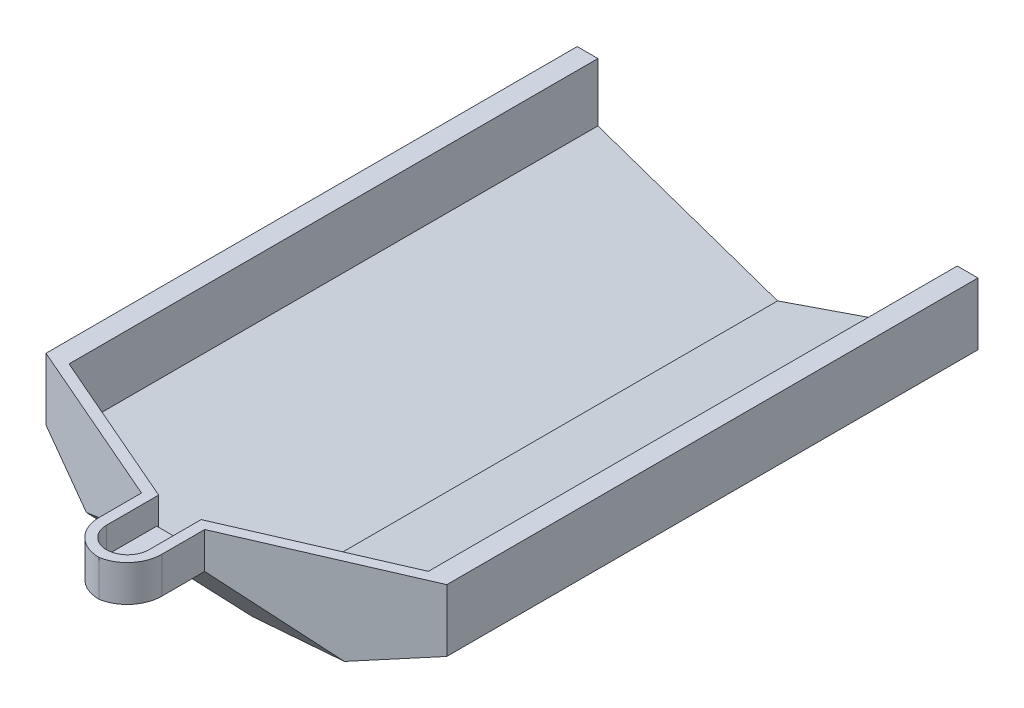
ISO-10303-21;
HEADER;
FILE_DESCRIPTION(('STEP AP214'),'2;1');
FILE_NAME('part.step','',(''),(''),'','','');
FILE_SCHEMA(('AUTOMOTIVE_DESIGN { 1 0 10303 214 1 1 1 1 }'));
ENDSEC;
DATA;
#1=APPLICATION_CONTEXT('core data for automotive mechanical design processes');
#2=APPLICATION_PROTOCOL_DEFINITION('international standard','automotive_design',2000,#1);
#3=PRODUCT_CONTEXT('',#1,'mechanical');
#4=PRODUCT('Part','Part','',(#3));
#5=PRODUCT_RELATED_PRODUCT_CATEGORY('part','',(#4));
#6=PRODUCT_DEFINITION_FORMATION('','',#4);
#7=PRODUCT_DEFINITION_CONTEXT('part definition',#1,'design');
#8=PRODUCT_DEFINITION('design','',#6,#7);
#9=PRODUCT_DEFINITION_SHAPE('','',#8);
#10=(LENGTH_UNIT() NAMED_UNIT(*) SI_UNIT(.MILLI.,.METRE.));
#11=(NAMED_UNIT(*) PLANE_ANGLE_UNIT() SI_UNIT($,.RADIAN.));
#12=(NAMED_UNIT(*) SI_UNIT($,.STERADIAN.) SOLID_ANGLE_UNIT());
#13=UNCERTAINTY_MEASURE_WITH_UNIT(LENGTH_MEASURE(1.E-05),#10,'distance_accuracy_value','');
#14=(GEOMETRIC_REPRESENTATION_CONTEXT(3) GLOBAL_UNCERTAINTY_ASSIGNED_CONTEXT((#13)) GLOBAL_UNIT_ASSIGNED_CONTEXT((#10,
#11,#12)) REPRESENTATION_CONTEXT('',''));
#15=CARTESIAN_POINT('',(0.,0.,0.));
#16=DIRECTION('',(0.,0.,1.));
#17=DIRECTION('',(1.,0.,0.));
#18=AXIS2_PLACEMENT_3D('',#15,#16,#17);
#19=CARTESIAN_POINT('',(-58.0000000000001,19.9221003062286,197.25));
#20=DIRECTION('',(1.,0.,0.));
#21=DIRECTION('',(0.,1.,0.));
#22=AXIS2_PLACEMENT_3D('',#19,#20,#21);
#23=PLANE('',#22);
#24=DIRECTION('',(0.,0.,-1.));
#25=VECTOR('',#24,1.);
#26=CARTESIAN_POINT('',(-58.0000000000001,19.9221003062286,197.25));
#27=LINE('',#26,#25);
#28=CARTESIAN_POINT('',(-58.,19.9221003062286,153.75));
#29=VERTEX_POINT('',#28);
#30=CARTESIAN_POINT('',(-58.0000000000001,19.9221003062286,0.));
#31=VERTEX_POINT('',#30);
#32=EDGE_CURVE('E335',#29,#31,#27,.T.);
#33=ORIENTED_EDGE('',*,*,#32,.F.);
#34=DIRECTION('',(0.,1.,0.));
#35=VECTOR('',#34,1.);
#36=CARTESIAN_POINT('',(-58.,0.,153.75));
#37=LINE('',#36,#35);
#38=CARTESIAN_POINT('',(-58.,37.9221003062286,153.75));
#39=VERTEX_POINT('',#38);
#40=EDGE_CURVE('E304',#29,#39,#37,.T.);
#41=ORIENTED_EDGE('',*,*,#40,.T.);
#42=DIRECTION('',(0.,0.,-1.));
#43=VECTOR('',#42,1.);
#44=CARTESIAN_POINT('',(-58.,37.9221003062286,197.25));
#45=LINE('',#44,#43);
#46=CARTESIAN_POINT('',(-58.,37.9221003062286,0.));
#47=VERTEX_POINT('',#46);
#48=EDGE_CURVE('E326',#39,#47,#45,.T.);
#49=ORIENTED_EDGE('',*,*,#48,.T.);
#50=DIRECTION('',(0.,-1.,0.));
#51=VECTOR('',#50,1.);
#52=CARTESIAN_POINT('',(-58.0000000000001,19.9221003062286,0.));
#53=LINE('',#52,#51);
#54=EDGE_CURVE('E311',#47,#31,#53,.T.);
#55=ORIENTED_EDGE('',*,*,#54,.T.);
#56=EDGE_LOOP('',(#33,#41,#49,#55));
#57=FACE_BOUND('',#56,.T.);
#58=ADVANCED_FACE('F31',(#57),#23,.F.);
#59=CARTESIAN_POINT('',(0.,0.,197.25));
#60=DIRECTION('',(0.324855184434761,0.945763770264994,0.));
#61=DIRECTION('',(-0.945763770264995,0.324855184434761,0.));
#62=AXIS2_PLACEMENT_3D('',#59,#60,#61);
#63=PLANE('',#62);
#64=DIRECTION('',(0.,0.,-1.));
#65=VECTOR('',#64,1.);
#66=CARTESIAN_POINT('',(0.,0.,197.25));
#67=LINE('',#66,#65);
#68=CARTESIAN_POINT('',(0.,0.,151.960177851496));
#69=VERTEX_POINT('',#68);
#70=CARTESIAN_POINT('',(0.,0.,0.));
#71=VERTEX_POINT('',#70);
#72=EDGE_CURVE('E333',#69,#71,#67,.T.);
#73=ORIENTED_EDGE('',*,*,#72,.F.);
#74=DIRECTION('',(-0.912471414880628,0.313419776789969,0.262990419108131));
#75=VECTOR('',#74,1.);
#76=CARTESIAN_POINT('',(-10.8682547723689,3.73307692635829,155.09260132356));
#77=LINE('',#76,#75);
#78=CARTESIAN_POINT('',(-37.3374208710378,12.8248248925636,162.721483688759));
#79=VERTEX_POINT('',#78);
#80=EDGE_CURVE('E280',#69,#79,#77,.T.);
#81=ORIENTED_EDGE('',*,*,#80,.T.);
#82=DIRECTION('',(-0.87487273062937,0.300505211979007,-0.379860925569558));
#83=VECTOR('',#82,1.);
#84=CARTESIAN_POINT('',(6.08728276581655,-2.09088720436162,181.576052517545));
#85=LINE('',#84,#83);
#86=EDGE_CURVE('E307',#79,#29,#85,.T.);
#87=ORIENTED_EDGE('',*,*,#86,.T.);
#88=ORIENTED_EDGE('',*,*,#32,.T.);
#89=DIRECTION('',(0.945763770264994,-0.324855184434761,0.));
#90=VECTOR('',#89,1.);
#91=CARTESIAN_POINT('',(0.,0.,0.));
#92=LINE('',#91,#90);
#93=EDGE_CURVE('E314',#31,#71,#92,.T.);
#94=ORIENTED_EDGE('',*,*,#93,.T.);
#95=EDGE_LOOP('',(#73,#81,#87,#88,#94));
#96=FACE_BOUND('',#95,.T.);
#97=ADVANCED_FACE('F448',(#96),#63,.F.);
#98=CARTESIAN_POINT('',(0.,0.,197.25));
#99=DIRECTION('',(-0.324855184434761,0.945763770264994,0.));
#100=DIRECTION('',(-0.945763770264995,-0.324855184434761,0.));
#101=AXIS2_PLACEMENT_3D('',#98,#99,#100);
#102=PLANE('',#101);
#103=DIRECTION('',(-0.87487273062937,-0.300505211979007,0.379860925569558));
#104=VECTOR('',#103,1.);
#105=CARTESIAN_POINT('',(-6.08728276581655,-2.09088720436162,181.576052517545));
#106=LINE('',#105,#104);
#107=CARTESIAN_POINT('',(58.,19.9221003062286,153.75));
#108=VERTEX_POINT('',#107);
#109=CARTESIAN_POINT('',(37.3374208710377,12.8248248925636,162.721483688759));
#110=VERTEX_POINT('',#109);
#111=EDGE_CURVE('E295',#108,#110,#106,.T.);
#112=ORIENTED_EDGE('',*,*,#111,.T.);
#113=DIRECTION('',(-0.912471414880628,-0.313419776789969,-0.262990419108131));
#114=VECTOR('',#113,1.);
#115=CARTESIAN_POINT('',(10.8682547723689,3.73307692635829,155.09260132356));
#116=LINE('',#115,#114);
#117=EDGE_CURVE('E277',#110,#69,#116,.T.);
#118=ORIENTED_EDGE('',*,*,#117,.T.);
#119=ORIENTED_EDGE('',*,*,#72,.T.);
#120=DIRECTION('',(0.945763770264994,0.324855184434761,0.));
#121=VECTOR('',#120,1.);
#122=CARTESIAN_POINT('',(0.,0.,0.));
#123=LINE('',#122,#121);
#124=CARTESIAN_POINT('',(58.0000000000001,19.9221003062286,0.));
#125=VERTEX_POINT('',#124);
#126=EDGE_CURVE('E317',#71,#125,#123,.T.);
#127=ORIENTED_EDGE('',*,*,#126,.T.);
#128=DIRECTION('',(0.,0.,-1.));
#129=VECTOR('',#128,1.);
#130=CARTESIAN_POINT('',(58.0000000000001,19.9221003062286,197.25));
#131=LINE('',#130,#129);
#132=EDGE_CURVE('E331',#108,#125,#131,.T.);
#133=ORIENTED_EDGE('',*,*,#132,.F.);
#134=EDGE_LOOP('',(#112,#118,#119,#127,#133));
#135=FACE_BOUND('',#134,.T.);
#136=ADVANCED_FACE('F445',(#135),#102,.F.);
#137=CARTESIAN_POINT('',(58.0000000000001,19.9221003062286,197.25));
#138=DIRECTION('',(-1.,0.,0.));
#139=DIRECTION('',(0.,-1.,0.));
#140=AXIS2_PLACEMENT_3D('',#137,#138,#139);
#141=PLANE('',#140);
#142=DIRECTION('',(0.,0.,-1.));
#143=VECTOR('',#142,1.);
#144=CARTESIAN_POINT('',(58.,37.9221003062286,197.25));
#145=LINE('',#144,#143);
#146=CARTESIAN_POINT('',(58.,37.9221003062286,153.75));
#147=VERTEX_POINT('',#146);
#148=CARTESIAN_POINT('',(58.,37.9221003062286,0.));
#149=VERTEX_POINT('',#148);
#150=EDGE_CURVE('E329',#147,#149,#145,.T.);
#151=ORIENTED_EDGE('',*,*,#150,.F.);
#152=DIRECTION('',(0.,1.,0.));
#153=VECTOR('',#152,1.);
#154=CARTESIAN_POINT('',(58.,0.,153.75));
#155=LINE('',#154,#153);
#156=EDGE_CURVE('E292',#108,#147,#155,.T.);
#157=ORIENTED_EDGE('',*,*,#156,.F.);
#158=ORIENTED_EDGE('',*,*,#132,.T.);
#159=DIRECTION('',(0.,1.,0.));
#160=VECTOR('',#159,1.);
#161=CARTESIAN_POINT('',(58.0000000000001,19.9221003062286,0.));
#162=LINE('',#161,#160);
#163=EDGE_CURVE('E320',#125,#149,#162,.T.);
#164=ORIENTED_EDGE('',*,*,#163,.T.);
#165=EDGE_LOOP('',(#151,#157,#158,#164));
#166=FACE_BOUND('',#165,.T.);
#167=ADVANCED_FACE('F441',(#166),#141,.F.);
#168=CARTESIAN_POINT('',(58.,37.9221003062286,197.25));
#169=DIRECTION('',(0.,-1.,0.));
#170=DIRECTION('',(0.,0.,-1.));
#171=AXIS2_PLACEMENT_3D('',#168,#169,#170);
#172=PLANE('',#171);
#173=DIRECTION('',(0.,0.,-1.));
#174=VECTOR('',#173,1.);
#175=CARTESIAN_POINT('',(-52.,37.9221003062286,197.25));
#176=LINE('',#175,#174);
#177=CARTESIAN_POINT('',(-52.,37.9221003062286,153.084560395029));
#178=VERTEX_POINT('',#177);
#179=CARTESIAN_POINT('',(-52.,37.9221003062286,0.));
#180=VERTEX_POINT('',#179);
#181=EDGE_CURVE('E235',#178,#180,#176,.T.);
#182=ORIENTED_EDGE('',*,*,#181,.T.);
#183=DIRECTION('',(-1.,0.,0.));
#184=VECTOR('',#183,1.);
#185=CARTESIAN_POINT('',(58.,37.9221003062286,0.));
#186=LINE('',#185,#184);
#187=EDGE_CURVE('E323',#180,#47,#186,.T.);
#188=ORIENTED_EDGE('',*,*,#187,.T.);
#189=ORIENTED_EDGE('',*,*,#48,.F.);
#190=DIRECTION('',(-0.917268733191235,0.,-0.398268842755426));
#191=VECTOR('',#190,1.);
#192=CARTESIAN_POINT('',(-9.15,37.9221003062286,174.960177851496));
#193=LINE('',#192,#191);
#194=CARTESIAN_POINT('',(-9.15,37.9221003062286,174.960177851496));
#195=VERTEX_POINT('',#194);
#196=EDGE_CURVE('E301',#195,#39,#193,.T.);
#197=ORIENTED_EDGE('',*,*,#196,.F.);
#198=DIRECTION('',(0.,0.,-1.));
#199=VECTOR('',#198,1.);
#200=CARTESIAN_POINT('',(-9.15,37.9221003062286,197.25));
#201=LINE('',#200,#199);
#202=CARTESIAN_POINT('',(-9.15,37.9221003062286,187.25));
#203=VERTEX_POINT('',#202);
#204=EDGE_CURVE('E299',#203,#195,#201,.T.);
#205=ORIENTED_EDGE('',*,*,#204,.F.);
#206=CARTESIAN_POINT('',(0.85,37.9221003062286,187.25));
#207=DIRECTION('',(0.,-1.,0.));
#208=DIRECTION('',(0.,0.,-1.));
#209=AXIS2_PLACEMENT_3D('',#206,#207,#208);
#210=CIRCLE('',#209,10.);
#211=CARTESIAN_POINT('',(0.850000000000017,37.9221003062286,197.25));
#212=VERTEX_POINT('',#211);
#213=EDGE_CURVE('E345',#203,#212,#210,.F.);
#214=ORIENTED_EDGE('',*,*,#213,.T.);
#215=CARTESIAN_POINT('',(-0.85,37.9221003062286,187.395559376606));
#216=DIRECTION('',(0.,-1.,0.));
#217=DIRECTION('',(0.,0.,-1.));
#218=AXIS2_PLACEMENT_3D('',#215,#216,#217);
#219=CIRCLE('',#218,10.);
#220=CARTESIAN_POINT('',(9.15,37.9221003062286,187.395559376606));
#221=VERTEX_POINT('',#220);
#222=EDGE_CURVE('E357',#212,#221,#219,.F.);
#223=ORIENTED_EDGE('',*,*,#222,.T.);
#224=DIRECTION('',(0.,0.,1.));
#225=VECTOR('',#224,1.);
#226=CARTESIAN_POINT('',(9.15,37.9221003062286,197.25));
#227=LINE('',#226,#225);
#228=CARTESIAN_POINT('',(9.15,37.9221003062286,174.960177851496));
#229=VERTEX_POINT('',#228);
#230=EDGE_CURVE('E289',#229,#221,#227,.T.);
#231=ORIENTED_EDGE('',*,*,#230,.F.);
#232=DIRECTION('',(-0.917268733191235,0.,0.398268842755426));
#233=VECTOR('',#232,1.);
#234=CARTESIAN_POINT('',(9.15,37.9221003062286,174.960177851496));
#235=LINE('',#234,#233);
#236=EDGE_CURVE('E286',#147,#229,#235,.T.);
#237=ORIENTED_EDGE('',*,*,#236,.F.);
#238=ORIENTED_EDGE('',*,*,#150,.T.);
#239=CARTESIAN_POINT('',(52.,37.9221003062286,0.));
#240=VERTEX_POINT('',#239);
#241=EDGE_CURVE('E324',#149,#240,#186,.T.);
#242=ORIENTED_EDGE('',*,*,#241,.T.);
#243=DIRECTION('',(0.,0.,-1.));
#244=VECTOR('',#243,1.);
#245=CARTESIAN_POINT('',(52.,37.9221003062286,197.25));
#246=LINE('',#245,#244);
#247=CARTESIAN_POINT('',(52.,37.9221003062286,153.084560395029));
#248=VERTEX_POINT('',#247);
#249=EDGE_CURVE('E197',#248,#240,#246,.T.);
#250=ORIENTED_EDGE('',*,*,#249,.F.);
#251=DIRECTION('',(-0.917268733191235,0.,0.398268842755426));
#252=VECTOR('',#251,1.);
#253=CARTESIAN_POINT('',(7.95519347173372,37.9221003062286,172.208371651922));
#254=LINE('',#253,#252);
#255=CARTESIAN_POINT('',(6.15,37.9221003062286,172.992168470588));
#256=VERTEX_POINT('',#255);
#257=EDGE_CURVE('E255',#248,#256,#254,.T.);
#258=ORIENTED_EDGE('',*,*,#257,.T.);
#259=DIRECTION('',(0.,0.,1.));
#260=VECTOR('',#259,1.);
#261=CARTESIAN_POINT('',(6.15,37.9221003062286,197.25));
#262=LINE('',#261,#260);
#263=CARTESIAN_POINT('',(6.15,37.9221003062286,188.08));
#264=VERTEX_POINT('',#263);
#265=EDGE_CURVE('E243',#256,#264,#262,.T.);
#266=ORIENTED_EDGE('',*,*,#265,.T.);
#267=CARTESIAN_POINT('',(-0.0199999999999992,37.9221003062286,188.08));
#268=DIRECTION('',(0.,-1.,0.));
#269=DIRECTION('',(0.,0.,-1.));
#270=AXIS2_PLACEMENT_3D('',#267,#268,#269);
#271=CIRCLE('',#270,6.17);
#272=CARTESIAN_POINT('',(-0.0199999999999992,37.9221003062286,194.25));
#273=VERTEX_POINT('',#272);
#274=EDGE_CURVE('E366',#264,#273,#271,.T.);
#275=ORIENTED_EDGE('',*,*,#274,.T.);
#276=CARTESIAN_POINT('',(0.0200000000000004,37.9221003062286,188.080129661006));
#277=DIRECTION('',(0.,-1.,0.));
#278=DIRECTION('',(0.,0.,-1.));
#279=AXIS2_PLACEMENT_3D('',#276,#277,#278);
#280=CIRCLE('',#279,6.17);
#281=CARTESIAN_POINT('',(-6.15,37.9221003062286,188.080129661006));
#282=VERTEX_POINT('',#281);
#283=EDGE_CURVE('E11',#273,#282,#280,.T.);
#284=ORIENTED_EDGE('',*,*,#283,.T.);
#285=DIRECTION('',(0.,0.,-1.));
#286=VECTOR('',#285,1.);
#287=CARTESIAN_POINT('',(-6.15,37.9221003062286,197.25));
#288=LINE('',#287,#286);
#289=CARTESIAN_POINT('',(-6.15,37.9221003062286,172.992168470588));
#290=VERTEX_POINT('',#289);
#291=EDGE_CURVE('E237',#282,#290,#288,.T.);
#292=ORIENTED_EDGE('',*,*,#291,.T.);
#293=DIRECTION('',(-0.917268733191235,0.,-0.398268842755426));
#294=VECTOR('',#293,1.);
#295=CARTESIAN_POINT('',(-7.95519347173372,37.9221003062286,172.208371651922));
#296=LINE('',#295,#294);
#297=EDGE_CURVE('E252',#290,#178,#296,.T.);
#298=ORIENTED_EDGE('',*,*,#297,.T.);
#299=EDGE_LOOP('',(#182,#188,#189,#197,#205,#214,#223,#231,#237,#238,#242,#250,#258,#266,#275,
#284,#292,#298));
#300=FACE_BOUND('',#299,.T.);
#301=ADVANCED_FACE('F379',(#300),#172,.F.);
#302=CARTESIAN_POINT('',(-58.,37.9221003062286,0.));
#303=DIRECTION('',(0.,0.,1.));
#304=DIRECTION('',(1.,0.,0.));
#305=AXIS2_PLACEMENT_3D('',#302,#303,#304);
#306=PLANE('',#305);
#307=ORIENTED_EDGE('',*,*,#187,.F.);
#308=DIRECTION('',(0.,-1.,0.));
#309=VECTOR('',#308,1.);
#310=CARTESIAN_POINT('',(-52.,37.9221003062286,0.));
#311=LINE('',#310,#309);
#312=CARTESIAN_POINT('',(-52.0000000000001,21.0332328389297,0.));
#313=VERTEX_POINT('',#312);
#314=EDGE_CURVE('E206',#180,#313,#311,.T.);
#315=ORIENTED_EDGE('',*,*,#314,.T.);
#316=DIRECTION('',(0.945763770264995,-0.324855184434761,0.));
#317=VECTOR('',#316,1.);
#318=CARTESIAN_POINT('',(-62.5556871990764,24.6589476523981,0.));
#319=LINE('',#318,#317);
#320=CARTESIAN_POINT('',(0.,3.17203946093159,0.));
#321=VERTEX_POINT('',#320);
#322=EDGE_CURVE('E212',#313,#321,#319,.T.);
#323=ORIENTED_EDGE('',*,*,#322,.T.);
#324=DIRECTION('',(0.945763770264995,0.324855184434761,0.));
#325=VECTOR('',#324,1.);
#326=CARTESIAN_POINT('',(-41.202729461843,-10.9804589740552,0.));
#327=LINE('',#326,#325);
#328=CARTESIAN_POINT('',(52.0000000000001,21.0332328389297,0.));
#329=VERTEX_POINT('',#328);
#330=EDGE_CURVE('E190',#321,#329,#327,.T.);
#331=ORIENTED_EDGE('',*,*,#330,.T.);
#332=DIRECTION('',(0.,1.,0.));
#333=VECTOR('',#332,1.);
#334=CARTESIAN_POINT('',(52.,37.9221003062294,0.));
#335=LINE('',#334,#333);
#336=EDGE_CURVE('E200',#329,#240,#335,.T.);
#337=ORIENTED_EDGE('',*,*,#336,.T.);
#338=ORIENTED_EDGE('',*,*,#241,.F.);
#339=ORIENTED_EDGE('',*,*,#163,.F.);
#340=ORIENTED_EDGE('',*,*,#126,.F.);
#341=ORIENTED_EDGE('',*,*,#93,.F.);
#342=ORIENTED_EDGE('',*,*,#54,.F.);
#343=EDGE_LOOP('',(#307,#315,#323,#331,#337,#338,#339,#340,#341,#342));
#344=FACE_BOUND('',#343,.T.);
#345=ADVANCED_FACE('F209',(#344),#306,.F.);
#346=CARTESIAN_POINT('',(-9.15,0.,174.960177851496));
#347=DIRECTION('',(0.398268842755426,0.,-0.917268733191235));
#348=DIRECTION('',(-0.917268733191235,0.,-0.398268842755426));
#349=AXIS2_PLACEMENT_3D('',#346,#347,#348);
#350=PLANE('',#349);
#351=ORIENTED_EDGE('',*,*,#86,.F.);
#352=DIRECTION('',(0.828664330042326,0.428790205836544,0.359797703569878));
#353=VECTOR('',#352,1.);
#354=CARTESIAN_POINT('',(-18.889525695469,22.3706403485988,170.731373917205));
#355=LINE('',#354,#353);
#356=CARTESIAN_POINT('',(-9.15,27.4103326296665,174.960177851496));
#357=VERTEX_POINT('',#356);
#358=EDGE_CURVE('E283',#79,#357,#355,.T.);
#359=ORIENTED_EDGE('',*,*,#358,.T.);
#360=DIRECTION('',(0.,1.,0.));
#361=VECTOR('',#360,1.);
#362=CARTESIAN_POINT('',(-9.15,0.,174.960177851496));
#363=LINE('',#362,#361);
#364=EDGE_CURVE('E303',#357,#195,#363,.T.);
#365=ORIENTED_EDGE('',*,*,#364,.T.);
#366=ORIENTED_EDGE('',*,*,#196,.T.);
#367=ORIENTED_EDGE('',*,*,#40,.F.);
#368=EDGE_LOOP('',(#351,#359,#365,#366,#367));
#369=FACE_BOUND('',#368,.T.);
#370=ADVANCED_FACE('F411',(#369),#350,.F.);
#371=CARTESIAN_POINT('',(-9.15,0.,197.25));
#372=DIRECTION('',(1.,0.,0.));
#373=DIRECTION('',(0.,0.,-1.));
#374=AXIS2_PLACEMENT_3D('',#371,#372,#373);
#375=PLANE('',#374);
#376=DIRECTION('',(0.,0.,1.));
#377=VECTOR('',#376,1.);
#378=CARTESIAN_POINT('',(-9.15,27.4103326296665,197.25));
#379=LINE('',#378,#377);
#380=CARTESIAN_POINT('',(-9.15,27.4103326296665,187.25));
#381=VERTEX_POINT('',#380);
#382=EDGE_CURVE('E274',#357,#381,#379,.T.);
#383=ORIENTED_EDGE('',*,*,#382,.T.);
#384=DIRECTION('',(0.,1.,0.));
#385=VECTOR('',#384,1.);
#386=CARTESIAN_POINT('',(-9.15,37.9221003062286,187.25));
#387=LINE('',#386,#385);
#388=EDGE_CURVE('E342',#381,#203,#387,.T.);
#389=ORIENTED_EDGE('',*,*,#388,.T.);
#390=ORIENTED_EDGE('',*,*,#204,.T.);
#391=ORIENTED_EDGE('',*,*,#364,.F.);
#392=EDGE_LOOP('',(#383,#389,#390,#391));
#393=FACE_BOUND('',#392,.T.);
#394=ADVANCED_FACE('F414',(#393),#375,.F.);
#395=CARTESIAN_POINT('',(9.15,0.,174.960177851496));
#396=DIRECTION('',(-0.398268842755426,0.,-0.917268733191235));
#397=DIRECTION('',(-0.917268733191235,0.,0.398268842755426));
#398=AXIS2_PLACEMENT_3D('',#395,#396,#397);
#399=PLANE('',#398);
#400=DIRECTION('',(0.,1.,0.));
#401=VECTOR('',#400,1.);
#402=CARTESIAN_POINT('',(9.15,0.,174.960177851496));
#403=LINE('',#402,#401);
#404=CARTESIAN_POINT('',(9.15,27.4103326296665,174.960177851496));
#405=VERTEX_POINT('',#404);
#406=EDGE_CURVE('E293',#405,#229,#403,.T.);
#407=ORIENTED_EDGE('',*,*,#406,.F.);
#408=DIRECTION('',(0.828664330042326,-0.428790205836544,-0.359797703569878));
#409=VECTOR('',#408,1.);
#410=CARTESIAN_POINT('',(18.889525695469,22.3706403485988,170.731373917205));
#411=LINE('',#410,#409);
#412=EDGE_CURVE('E339',#405,#110,#411,.T.);
#413=ORIENTED_EDGE('',*,*,#412,.T.);
#414=ORIENTED_EDGE('',*,*,#111,.F.);
#415=ORIENTED_EDGE('',*,*,#156,.T.);
#416=ORIENTED_EDGE('',*,*,#236,.T.);
#417=EDGE_LOOP('',(#407,#413,#414,#415,#416));
#418=FACE_BOUND('',#417,.T.);
#419=ADVANCED_FACE('F437',(#418),#399,.F.);
#420=CARTESIAN_POINT('',(9.15,0.,197.25));
#421=DIRECTION('',(-1.,0.,0.));
#422=DIRECTION('',(0.,0.,1.));
#423=AXIS2_PLACEMENT_3D('',#420,#421,#422);
#424=PLANE('',#423);
#425=ORIENTED_EDGE('',*,*,#230,.T.);
#426=DIRECTION('',(0.,1.,0.));
#427=VECTOR('',#426,1.);
#428=CARTESIAN_POINT('',(9.15,0.,187.395559376606));
#429=LINE('',#428,#427);
#430=CARTESIAN_POINT('',(9.15,27.4103326296665,187.395559376606));
#431=VERTEX_POINT('',#430);
#432=EDGE_CURVE('E352',#221,#431,#429,.F.);
#433=ORIENTED_EDGE('',*,*,#432,.T.);
#434=DIRECTION('',(0.,0.,-1.));
#435=VECTOR('',#434,1.);
#436=CARTESIAN_POINT('',(9.15,27.4103326296665,197.25));
#437=LINE('',#436,#435);
#438=EDGE_CURVE('E337',#431,#405,#437,.T.);
#439=ORIENTED_EDGE('',*,*,#438,.T.);
#440=ORIENTED_EDGE('',*,*,#406,.T.);
#441=EDGE_LOOP('',(#425,#433,#439,#440));
#442=FACE_BOUND('',#441,.T.);
#443=ADVANCED_FACE('F426',(#442),#424,.F.);
#444=CARTESIAN_POINT('',(-50.,27.4103326296665,174.960177851496));
#445=DIRECTION('',(0.,0.642787609686544,-0.766044443118974));
#446=DIRECTION('',(0.,0.766044443118974,0.642787609686544));
#447=AXIS2_PLACEMENT_3D('',#444,#445,#446);
#448=PLANE('',#447);
#449=ORIENTED_EDGE('',*,*,#80,.F.);
#450=ORIENTED_EDGE('',*,*,#117,.F.);
#451=ORIENTED_EDGE('',*,*,#412,.F.);
#452=DIRECTION('',(1.,0.,0.));
#453=VECTOR('',#452,1.);
#454=CARTESIAN_POINT('',(-50.,27.4103326296665,174.960177851496));
#455=LINE('',#454,#453);
#456=EDGE_CURVE('E262',#357,#405,#455,.T.);
#457=ORIENTED_EDGE('',*,*,#456,.F.);
#458=ORIENTED_EDGE('',*,*,#358,.F.);
#459=EDGE_LOOP('',(#449,#450,#451,#457,#458));
#460=FACE_BOUND('',#459,.T.);
#461=ADVANCED_FACE('F435',(#460),#448,.F.);
#462=CARTESIAN_POINT('',(-50.,27.4103326296665,197.25));
#463=DIRECTION('',(0.,1.,0.));
#464=DIRECTION('',(0.,0.,1.));
#465=AXIS2_PLACEMENT_3D('',#462,#463,#464);
#466=PLANE('',#465);
#467=ORIENTED_EDGE('',*,*,#438,.F.);
#468=CARTESIAN_POINT('',(-0.85,27.4103326296665,187.395559376606));
#469=DIRECTION('',(0.,1.,0.));
#470=DIRECTION('',(0.,0.,1.));
#471=AXIS2_PLACEMENT_3D('',#468,#469,#470);
#472=CIRCLE('',#471,10.);
#473=CARTESIAN_POINT('',(0.850000000000004,27.4103326296665,197.25));
#474=VERTEX_POINT('',#473);
#475=EDGE_CURVE('E355',#431,#474,#472,.F.);
#476=ORIENTED_EDGE('',*,*,#475,.T.);
#477=CARTESIAN_POINT('',(0.85,27.4103326296665,187.25));
#478=DIRECTION('',(0.,1.,0.));
#479=DIRECTION('',(0.,0.,1.));
#480=AXIS2_PLACEMENT_3D('',#477,#478,#479);
#481=CIRCLE('',#480,10.);
#482=EDGE_CURVE('E350',#474,#381,#481,.F.);
#483=ORIENTED_EDGE('',*,*,#482,.T.);
#484=ORIENTED_EDGE('',*,*,#382,.F.);
#485=ORIENTED_EDGE('',*,*,#456,.T.);
#486=EDGE_LOOP('',(#467,#476,#483,#484,#485));
#487=FACE_BOUND('',#486,.T.);
#488=ADVANCED_FACE('F431',(#487),#466,.F.);
#489=CARTESIAN_POINT('',(-52.0000000000001,19.9221003062286,197.25));
#490=DIRECTION('',(1.,0.,0.));
#491=DIRECTION('',(0.,1.,0.));
#492=AXIS2_PLACEMENT_3D('',#489,#490,#491);
#493=PLANE('',#492);
#494=DIRECTION('',(0.,0.,-1.));
#495=VECTOR('',#494,1.);
#496=CARTESIAN_POINT('',(-52.0000000000001,21.0332328389297,197.25));
#497=LINE('',#496,#495);
#498=CARTESIAN_POINT('',(-52.0000000000001,21.0332328389297,153.084560395028));
#499=VERTEX_POINT('',#498);
#500=EDGE_CURVE('E221',#499,#313,#497,.T.);
#501=ORIENTED_EDGE('',*,*,#500,.T.);
#502=ORIENTED_EDGE('',*,*,#314,.F.);
#503=ORIENTED_EDGE('',*,*,#181,.F.);
#504=DIRECTION('',(0.,1.,0.));
#505=VECTOR('',#504,1.);
#506=CARTESIAN_POINT('',(-52.0000000000001,19.9221003062287,153.084560395028));
#507=LINE('',#506,#505);
#508=EDGE_CURVE('E224',#499,#178,#507,.T.);
#509=ORIENTED_EDGE('',*,*,#508,.F.);
#510=EDGE_LOOP('',(#501,#502,#503,#509));
#511=FACE_BOUND('',#510,.T.);
#512=ADVANCED_FACE('F399',(#511),#493,.T.);
#513=CARTESIAN_POINT('',(0.974565553304283,2.83729131079498,197.25));
#514=DIRECTION('',(0.324855184434761,0.945763770264994,0.));
#515=DIRECTION('',(-0.945763770264995,0.324855184434761,0.));
#516=AXIS2_PLACEMENT_3D('',#513,#514,#515);
#517=PLANE('',#516);
#518=DIRECTION('',(0.,0.,-1.));
#519=VECTOR('',#518,1.);
#520=CARTESIAN_POINT('',(0.,3.17203946093159,197.25));
#521=LINE('',#520,#519);
#522=CARTESIAN_POINT('',(0.,3.17203946093159,150.705613125247));
#523=VERTEX_POINT('',#522);
#524=EDGE_CURVE('E196',#523,#321,#521,.T.);
#525=ORIENTED_EDGE('',*,*,#524,.T.);
#526=ORIENTED_EDGE('',*,*,#322,.F.);
#527=ORIENTED_EDGE('',*,*,#500,.F.);
#528=DIRECTION('',(-0.87487273062937,0.300505211979007,-0.379860925569558));
#529=VECTOR('',#528,1.);
#530=CARTESIAN_POINT('',(8.00813550002589,0.421369138562868,179.139488265903));
#531=LINE('',#530,#529);
#532=CARTESIAN_POINT('',(-34.5467327058177,15.0383062577897,160.662593217942));
#533=VERTEX_POINT('',#532);
#534=EDGE_CURVE('E226',#533,#499,#531,.T.);
#535=ORIENTED_EDGE('',*,*,#534,.F.);
#536=DIRECTION('',(-0.912471414880628,0.313419776789969,0.262990419108131));
#537=VECTOR('',#536,1.);
#538=CARTESIAN_POINT('',(-10.2621534853367,6.69692999701419,153.663347474014));
#539=LINE('',#538,#537);
#540=EDGE_CURVE('E229',#523,#533,#539,.T.);
#541=ORIENTED_EDGE('',*,*,#540,.F.);
#542=EDGE_LOOP('',(#525,#526,#527,#535,#541));
#543=FACE_BOUND('',#542,.T.);
#544=ADVANCED_FACE('F534',(#543),#517,.T.);
#545=CARTESIAN_POINT('',(-0.974565553304283,2.83729131079498,197.25));
#546=DIRECTION('',(-0.324855184434761,0.945763770264994,0.));
#547=DIRECTION('',(-0.945763770264995,-0.324855184434761,0.));
#548=AXIS2_PLACEMENT_3D('',#545,#546,#547);
#549=PLANE('',#548);
#550=DIRECTION('',(-0.87487273062937,-0.300505211979007,0.379860925569558));
#551=VECTOR('',#550,1.);
#552=CARTESIAN_POINT('',(-8.00813550002589,0.421369138562868,179.139488265903));
#553=LINE('',#552,#551);
#554=CARTESIAN_POINT('',(52.0000000000001,21.0332328389297,153.084560395028));
#555=VERTEX_POINT('',#554);
#556=CARTESIAN_POINT('',(34.5467327058177,15.0383062577897,160.662593217942));
#557=VERTEX_POINT('',#556);
#558=EDGE_CURVE('E193',#555,#557,#553,.T.);
#559=ORIENTED_EDGE('',*,*,#558,.F.);
#560=DIRECTION('',(0.,0.,-1.));
#561=VECTOR('',#560,1.);
#562=CARTESIAN_POINT('',(52.0000000000001,21.0332328389297,197.25));
#563=LINE('',#562,#561);
#564=EDGE_CURVE('E185',#555,#329,#563,.T.);
#565=ORIENTED_EDGE('',*,*,#564,.T.);
#566=ORIENTED_EDGE('',*,*,#330,.F.);
#567=ORIENTED_EDGE('',*,*,#524,.F.);
#568=DIRECTION('',(-0.912471414880628,-0.313419776789969,-0.262990419108131));
#569=VECTOR('',#568,1.);
#570=CARTESIAN_POINT('',(10.2621534853367,6.69692999701419,153.663347474014));
#571=LINE('',#570,#569);
#572=EDGE_CURVE('E233',#557,#523,#571,.T.);
#573=ORIENTED_EDGE('',*,*,#572,.F.);
#574=EDGE_LOOP('',(#559,#565,#566,#567,#573));
#575=FACE_BOUND('',#574,.T.);
#576=ADVANCED_FACE('F187',(#575),#549,.T.);
#577=CARTESIAN_POINT('',(52.0000000000001,19.9221003062286,197.25));
#578=DIRECTION('',(-1.,0.,0.));
#579=DIRECTION('',(0.,-1.,0.));
#580=AXIS2_PLACEMENT_3D('',#577,#578,#579);
#581=PLANE('',#580);
#582=ORIENTED_EDGE('',*,*,#249,.T.);
#583=ORIENTED_EDGE('',*,*,#336,.F.);
#584=ORIENTED_EDGE('',*,*,#564,.F.);
#585=DIRECTION('',(0.,1.,0.));
#586=VECTOR('',#585,1.);
#587=CARTESIAN_POINT('',(52.0000000000003,3.83418328522698E-13,153.084560395028));
#588=LINE('',#587,#586);
#589=EDGE_CURVE('E241',#555,#248,#588,.T.);
#590=ORIENTED_EDGE('',*,*,#589,.T.);
#591=EDGE_LOOP('',(#582,#583,#584,#590));
#592=FACE_BOUND('',#591,.T.);
#593=ADVANCED_FACE('F201',(#592),#581,.T.);
#594=CARTESIAN_POINT('',(-7.95519347173372,0.,172.208371651922));
#595=DIRECTION('',(0.398268842755426,0.,-0.917268733191235));
#596=DIRECTION('',(-0.917268733191235,0.,-0.398268842755426));
#597=AXIS2_PLACEMENT_3D('',#594,#595,#596);
#598=PLANE('',#597);
#599=ORIENTED_EDGE('',*,*,#534,.T.);
#600=ORIENTED_EDGE('',*,*,#508,.T.);
#601=ORIENTED_EDGE('',*,*,#297,.F.);
#602=DIRECTION('',(0.,1.,0.));
#603=VECTOR('',#602,1.);
#604=CARTESIAN_POINT('',(-6.15,0.,172.992168470588));
#605=LINE('',#604,#603);
#606=CARTESIAN_POINT('',(-6.15,29.7321218602918,172.992168470588));
#607=VERTEX_POINT('',#606);
#608=EDGE_CURVE('E227',#607,#290,#605,.T.);
#609=ORIENTED_EDGE('',*,*,#608,.F.);
#610=DIRECTION('',(0.828664330042326,0.428790205836544,0.359797703569878));
#611=VECTOR('',#610,1.);
#612=CARTESIAN_POINT('',(-18.1877998768903,23.5031935718408,167.765477041119));
#613=LINE('',#612,#611);
#614=EDGE_CURVE('E232',#533,#607,#613,.T.);
#615=ORIENTED_EDGE('',*,*,#614,.F.);
#616=EDGE_LOOP('',(#599,#600,#601,#609,#615));
#617=FACE_BOUND('',#616,.T.);
#618=ADVANCED_FACE('F393',(#617),#598,.T.);
#619=CARTESIAN_POINT('',(-6.15,0.,197.25));
#620=DIRECTION('',(1.,0.,0.));
#621=DIRECTION('',(0.,0.,-1.));
#622=AXIS2_PLACEMENT_3D('',#619,#620,#621);
#623=PLANE('',#622);
#624=ORIENTED_EDGE('',*,*,#291,.F.);
#625=DIRECTION('',(0.,1.,0.));
#626=VECTOR('',#625,1.);
#627=CARTESIAN_POINT('',(-6.15,30.4103326296665,188.080129661006));
#628=LINE('',#627,#626);
#629=CARTESIAN_POINT('',(-6.15,30.4103326296665,188.080129661006));
#630=VERTEX_POINT('',#629);
#631=EDGE_CURVE('E46',#282,#630,#628,.F.);
#632=ORIENTED_EDGE('',*,*,#631,.T.);
#633=DIRECTION('',(0.,0.,1.));
#634=VECTOR('',#633,1.);
#635=CARTESIAN_POINT('',(-6.15,30.4103326296665,197.25));
#636=LINE('',#635,#634);
#637=CARTESIAN_POINT('',(-6.15,30.4103326296665,173.561254877031));
#638=VERTEX_POINT('',#637);
#639=EDGE_CURVE('E216',#638,#630,#636,.T.);
#640=ORIENTED_EDGE('',*,*,#639,.F.);
#641=DIRECTION('',(0.,0.766044443118974,0.642787609686544));
#642=VECTOR('',#641,1.);
#643=CARTESIAN_POINT('',(-6.15,24.229246821255,168.374708054918));
#644=LINE('',#643,#642);
#645=EDGE_CURVE('E259',#607,#638,#644,.T.);
#646=ORIENTED_EDGE('',*,*,#645,.F.);
#647=ORIENTED_EDGE('',*,*,#608,.T.);
#648=EDGE_LOOP('',(#624,#632,#640,#646,#647));
#649=FACE_BOUND('',#648,.T.);
#650=ADVANCED_FACE('F387',(#649),#623,.T.);
#651=CARTESIAN_POINT('',(7.95519347173372,0.,172.208371651922));
#652=DIRECTION('',(-0.398268842755426,0.,-0.917268733191235));
#653=DIRECTION('',(-0.917268733191235,0.,0.398268842755426));
#654=AXIS2_PLACEMENT_3D('',#651,#652,#653);
#655=PLANE('',#654);
#656=DIRECTION('',(0.,1.,0.));
#657=VECTOR('',#656,1.);
#658=CARTESIAN_POINT('',(6.15,0.,172.992168470588));
#659=LINE('',#658,#657);
#660=CARTESIAN_POINT('',(6.15,29.7321218602918,172.992168470588));
#661=VERTEX_POINT('',#660);
#662=EDGE_CURVE('E238',#661,#256,#659,.T.);
#663=ORIENTED_EDGE('',*,*,#662,.T.);
#664=ORIENTED_EDGE('',*,*,#257,.F.);
#665=ORIENTED_EDGE('',*,*,#589,.F.);
#666=ORIENTED_EDGE('',*,*,#558,.T.);
#667=DIRECTION('',(0.828664330042326,-0.428790205836544,-0.359797703569878));
#668=VECTOR('',#667,1.);
#669=CARTESIAN_POINT('',(18.1877998768903,23.5031935718408,167.765477041119));
#670=LINE('',#669,#668);
#671=EDGE_CURVE('E245',#661,#557,#670,.T.);
#672=ORIENTED_EDGE('',*,*,#671,.F.);
#673=EDGE_LOOP('',(#663,#664,#665,#666,#672));
#674=FACE_BOUND('',#673,.T.);
#675=ADVANCED_FACE('F493',(#674),#655,.T.);
#676=CARTESIAN_POINT('',(6.15,0.,197.25));
#677=DIRECTION('',(-1.,0.,0.));
#678=DIRECTION('',(0.,0.,1.));
#679=AXIS2_PLACEMENT_3D('',#676,#677,#678);
#680=PLANE('',#679);
#681=DIRECTION('',(0.,0.,-1.));
#682=VECTOR('',#681,1.);
#683=CARTESIAN_POINT('',(6.15,30.4103326296665,197.25));
#684=LINE('',#683,#682);
#685=CARTESIAN_POINT('',(6.15,30.4103326296665,188.08));
#686=VERTEX_POINT('',#685);
#687=CARTESIAN_POINT('',(6.15,30.4103326296665,173.561254877031));
#688=VERTEX_POINT('',#687);
#689=EDGE_CURVE('E223',#686,#688,#684,.T.);
#690=ORIENTED_EDGE('',*,*,#689,.F.);
#691=DIRECTION('',(0.,-1.,0.));
#692=VECTOR('',#691,1.);
#693=CARTESIAN_POINT('',(6.15,0.,188.08));
#694=LINE('',#693,#692);
#695=EDGE_CURVE('E364',#686,#264,#694,.F.);
#696=ORIENTED_EDGE('',*,*,#695,.T.);
#697=ORIENTED_EDGE('',*,*,#265,.F.);
#698=ORIENTED_EDGE('',*,*,#662,.F.);
#699=DIRECTION('',(0.,-0.766044443118974,-0.642787609686544));
#700=VECTOR('',#699,1.);
#701=CARTESIAN_POINT('',(6.15,24.229246821255,168.374708054918));
#702=LINE('',#701,#700);
#703=EDGE_CURVE('E248',#688,#661,#702,.T.);
#704=ORIENTED_EDGE('',*,*,#703,.F.);
#705=EDGE_LOOP('',(#690,#696,#697,#698,#704));
#706=FACE_BOUND('',#705,.T.);
#707=ADVANCED_FACE('F384',(#706),#680,.T.);
#708=CARTESIAN_POINT('',(-50.,29.3386954587261,172.662044522139));
#709=DIRECTION('',(0.,0.642787609686544,-0.766044443118974));
#710=DIRECTION('',(0.,0.766044443118974,0.642787609686544));
#711=AXIS2_PLACEMENT_3D('',#708,#709,#710);
#712=PLANE('',#711);
#713=ORIENTED_EDGE('',*,*,#540,.T.);
#714=ORIENTED_EDGE('',*,*,#614,.T.);
#715=ORIENTED_EDGE('',*,*,#645,.T.);
#716=DIRECTION('',(1.,0.,0.));
#717=VECTOR('',#716,1.);
#718=CARTESIAN_POINT('',(-50.,30.4103326296665,173.561254877031));
#719=LINE('',#718,#717);
#720=EDGE_CURVE('E213',#638,#688,#719,.T.);
#721=ORIENTED_EDGE('',*,*,#720,.T.);
#722=ORIENTED_EDGE('',*,*,#703,.T.);
#723=ORIENTED_EDGE('',*,*,#671,.T.);
#724=ORIENTED_EDGE('',*,*,#572,.T.);
#725=EDGE_LOOP('',(#713,#714,#715,#721,#722,#723,#724));
#726=FACE_BOUND('',#725,.T.);
#727=ADVANCED_FACE('F388',(#726),#712,.T.);
#728=CARTESIAN_POINT('',(-50.,30.4103326296665,197.25));
#729=DIRECTION('',(0.,1.,0.));
#730=DIRECTION('',(0.,0.,1.));
#731=AXIS2_PLACEMENT_3D('',#728,#729,#730);
#732=PLANE('',#731);
#733=ORIENTED_EDGE('',*,*,#639,.T.);
#734=CARTESIAN_POINT('',(0.0200000000000004,30.4103326296665,188.080129661006));
#735=DIRECTION('',(0.,1.,0.));
#736=DIRECTION('',(0.,0.,1.));
#737=AXIS2_PLACEMENT_3D('',#734,#735,#736);
#738=CIRCLE('',#737,6.17);
#739=CARTESIAN_POINT('',(-0.0199999999999992,30.4103326296665,194.25));
#740=VERTEX_POINT('',#739);
#741=EDGE_CURVE('E39',#630,#740,#738,.T.);
#742=ORIENTED_EDGE('',*,*,#741,.T.);
#743=CARTESIAN_POINT('',(-0.0199999999999992,30.4103326296665,188.08));
#744=DIRECTION('',(0.,1.,0.));
#745=DIRECTION('',(0.,0.,1.));
#746=AXIS2_PLACEMENT_3D('',#743,#744,#745);
#747=CIRCLE('',#746,6.17);
#748=EDGE_CURVE('E362',#740,#686,#747,.T.);
#749=ORIENTED_EDGE('',*,*,#748,.T.);
#750=ORIENTED_EDGE('',*,*,#689,.T.);
#751=ORIENTED_EDGE('',*,*,#720,.F.);
#752=EDGE_LOOP('',(#733,#742,#749,#750,#751));
#753=FACE_BOUND('',#752,.T.);
#754=ADVANCED_FACE('F371',(#753),#732,.T.);
#755=CARTESIAN_POINT('',(0.85,0.,187.25));
#756=DIRECTION('',(0.,-1.,0.));
#757=DIRECTION('',(0.,0.,-1.));
#758=AXIS2_PLACEMENT_3D('',#755,#756,#757);
#759=CYLINDRICAL_SURFACE('',#758,10.);
#760=ORIENTED_EDGE('',*,*,#482,.F.);
#761=DIRECTION('',(0.,1.,0.));
#762=VECTOR('',#761,1.);
#763=CARTESIAN_POINT('',(0.85,27.4103326296665,197.25));
#764=LINE('',#763,#762);
#765=EDGE_CURVE('E347',#212,#474,#764,.F.);
#766=ORIENTED_EDGE('',*,*,#765,.F.);
#767=ORIENTED_EDGE('',*,*,#213,.F.);
#768=ORIENTED_EDGE('',*,*,#388,.F.);
#769=EDGE_LOOP('',(#760,#766,#767,#768));
#770=FACE_BOUND('',#769,.T.);
#771=ADVANCED_FACE('F418',(#770),#759,.T.);
#772=CARTESIAN_POINT('',(-0.85,37.9221003062286,187.395559376606));
#773=DIRECTION('',(0.,1.,0.));
#774=DIRECTION('',(0.,0.,1.));
#775=AXIS2_PLACEMENT_3D('',#772,#773,#774);
#776=CYLINDRICAL_SURFACE('',#775,10.);
#777=ORIENTED_EDGE('',*,*,#222,.F.);
#778=ORIENTED_EDGE('',*,*,#765,.T.);
#779=ORIENTED_EDGE('',*,*,#475,.F.);
#780=ORIENTED_EDGE('',*,*,#432,.F.);
#781=EDGE_LOOP('',(#777,#778,#779,#780));
#782=FACE_BOUND('',#781,.T.);
#783=ADVANCED_FACE('F429',(#782),#776,.T.);
#784=CARTESIAN_POINT('',(-0.0199999999999992,37.9221003062286,188.08));
#785=DIRECTION('',(0.,-1.,0.));
#786=DIRECTION('',(0.,0.,-1.));
#787=AXIS2_PLACEMENT_3D('',#784,#785,#786);
#788=CYLINDRICAL_SURFACE('',#787,6.17);
#789=ORIENTED_EDGE('',*,*,#274,.F.);
#790=ORIENTED_EDGE('',*,*,#695,.F.);
#791=ORIENTED_EDGE('',*,*,#748,.F.);
#792=DIRECTION('',(0.,-1.,0.));
#793=VECTOR('',#792,1.);
#794=CARTESIAN_POINT('',(-0.0199999999999992,37.9221003062286,194.25));
#795=LINE('',#794,#793);
#796=EDGE_CURVE('E359',#273,#740,#795,.T.);
#797=ORIENTED_EDGE('',*,*,#796,.F.);
#798=EDGE_LOOP('',(#789,#790,#791,#797));
#799=FACE_BOUND('',#798,.T.);
#800=ADVANCED_FACE('F378',(#799),#788,.F.);
#801=CARTESIAN_POINT('',(0.0200000000000004,37.9221003062286,188.080129661006));
#802=DIRECTION('',(0.,-1.,0.));
#803=DIRECTION('',(0.,0.,-1.));
#804=AXIS2_PLACEMENT_3D('',#801,#802,#803);
#805=CYLINDRICAL_SURFACE('',#804,6.17);
#806=ORIENTED_EDGE('',*,*,#741,.F.);
#807=ORIENTED_EDGE('',*,*,#631,.F.);
#808=ORIENTED_EDGE('',*,*,#283,.F.);
#809=ORIENTED_EDGE('',*,*,#796,.T.);
#810=EDGE_LOOP('',(#806,#807,#808,#809));
#811=FACE_BOUND('',#810,.T.);
#812=ADVANCED_FACE('F33',(#811),#805,.F.);
#813=CLOSED_SHELL('',(#58,#97,#136,#167,#301,#345,#370,#394,#419,#443,#461,#488,#512,#544,#576,
#593,#618,#650,#675,#707,#727,#754,#771,#783,#800,#812));
#814=MANIFOLD_SOLID_BREP('B2',#813);
#815=ADVANCED_BREP_SHAPE_REPRESENTATION('',(#18,#814),#14);
#816=SHAPE_DEFINITION_REPRESENTATION(#9,#815);
ENDSEC;
END-ISO-10303-21;
